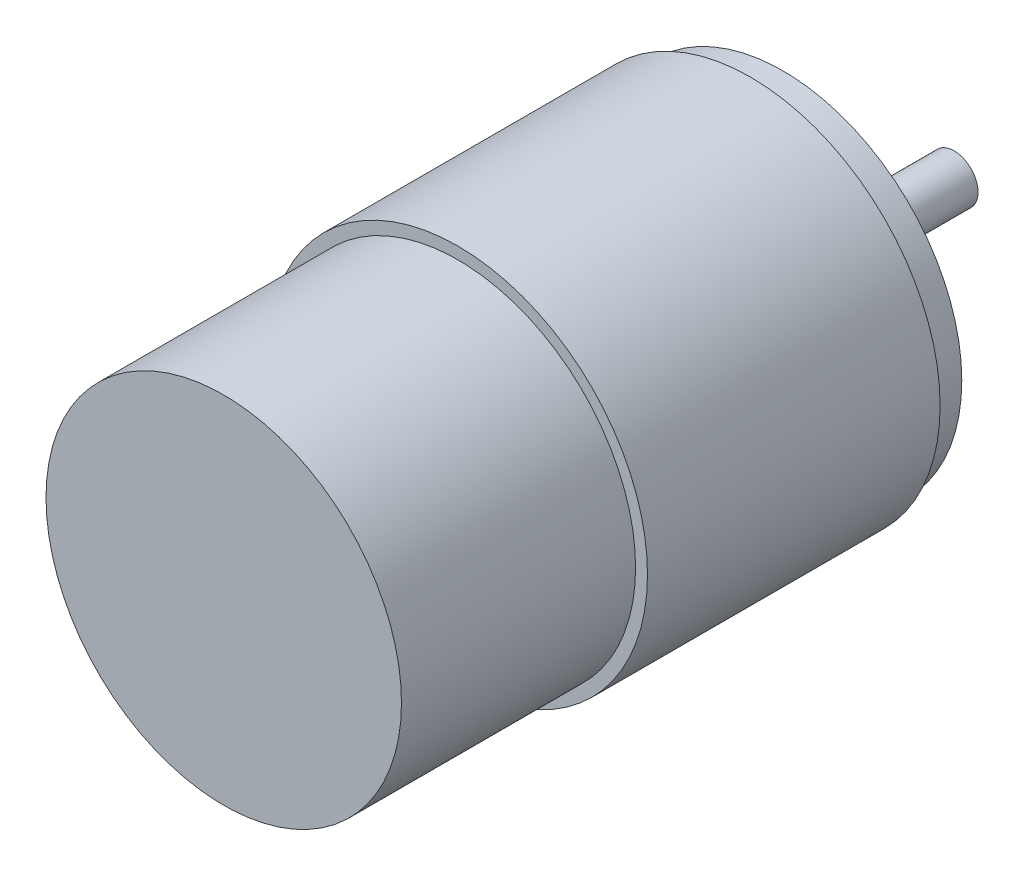
ISO-10303-21;
HEADER;
FILE_DESCRIPTION(('STEP AP214'),'2;1');
FILE_NAME('part.step','',(''),(''),'','','');
FILE_SCHEMA(('AUTOMOTIVE_DESIGN { 1 0 10303 214 1 1 1 1 }'));
ENDSEC;
DATA;
#1=APPLICATION_CONTEXT('core data for automotive mechanical design processes');
#2=APPLICATION_PROTOCOL_DEFINITION('international standard','automotive_design',2000,#1);
#3=PRODUCT_CONTEXT('',#1,'mechanical');
#4=PRODUCT('Part','Part','',(#3));
#5=PRODUCT_RELATED_PRODUCT_CATEGORY('part','',(#4));
#6=PRODUCT_DEFINITION_FORMATION('','',#4);
#7=PRODUCT_DEFINITION_CONTEXT('part definition',#1,'design');
#8=PRODUCT_DEFINITION('design','',#6,#7);
#9=PRODUCT_DEFINITION_SHAPE('','',#8);
#10=(LENGTH_UNIT() NAMED_UNIT(*) SI_UNIT(.MILLI.,.METRE.));
#11=(NAMED_UNIT(*) PLANE_ANGLE_UNIT() SI_UNIT($,.RADIAN.));
#12=(NAMED_UNIT(*) SI_UNIT($,.STERADIAN.) SOLID_ANGLE_UNIT());
#13=UNCERTAINTY_MEASURE_WITH_UNIT(LENGTH_MEASURE(1.E-05),#10,'distance_accuracy_value','');
#14=(GEOMETRIC_REPRESENTATION_CONTEXT(3) GLOBAL_UNCERTAINTY_ASSIGNED_CONTEXT((#13)) GLOBAL_UNIT_ASSIGNED_CONTEXT((#10,
#11,#12)) REPRESENTATION_CONTEXT('',''));
#15=CARTESIAN_POINT('',(0.,0.,0.));
#16=DIRECTION('',(0.,0.,1.));
#17=DIRECTION('',(1.,0.,0.));
#18=AXIS2_PLACEMENT_3D('',#15,#16,#17);
#19=CARTESIAN_POINT('',(0.,0.,3.81));
#20=DIRECTION('',(0.,0.,-1.));
#21=DIRECTION('',(-1.,0.,0.));
#22=AXIS2_PLACEMENT_3D('',#19,#20,#21);
#23=CYLINDRICAL_SURFACE('',#22,20.955);
#24=CARTESIAN_POINT('',(0.,0.,3.81));
#25=DIRECTION('',(0.,0.,1.));
#26=DIRECTION('',(1.,0.,0.));
#27=AXIS2_PLACEMENT_3D('',#24,#25,#26);
#28=CIRCLE('',#27,20.955);
#29=CARTESIAN_POINT('',(-20.955,0.,3.81));
#30=VERTEX_POINT('',#29);
#31=EDGE_CURVE('E57',#30,#30,#28,.T.);
#32=CARTESIAN_POINT('',(0.,0.,0.));
#33=DIRECTION('',(0.,0.,1.));
#34=DIRECTION('',(1.,0.,0.));
#35=AXIS2_PLACEMENT_3D('',#32,#33,#34);
#36=CIRCLE('',#35,20.955);
#37=CARTESIAN_POINT('',(-20.955,0.,0.));
#38=VERTEX_POINT('',#37);
#39=EDGE_CURVE('E34',#38,#38,#36,.T.);
#40=CARTESIAN_POINT('',(-20.955,0.,3.81));
#41=CARTESIAN_POINT('',(-20.955,0.,3.7703125));
#42=CARTESIAN_POINT('',(-20.955,0.,3.730625));
#43=CARTESIAN_POINT('',(-20.955,0.,3.65125));
#44=CARTESIAN_POINT('',(-20.955,0.,3.6115625));
#45=CARTESIAN_POINT('',(-20.955,0.,3.5321875));
#46=CARTESIAN_POINT('',(-20.955,0.,3.4925));
#47=CARTESIAN_POINT('',(-20.955,0.,3.413125));
#48=CARTESIAN_POINT('',(-20.955,0.,3.3734375));
#49=CARTESIAN_POINT('',(-20.955,0.,3.2940625));
#50=CARTESIAN_POINT('',(-20.955,0.,3.254375));
#51=CARTESIAN_POINT('',(-20.955,0.,3.175));
#52=CARTESIAN_POINT('',(-20.955,0.,3.1353125));
#53=CARTESIAN_POINT('',(-20.955,0.,3.0559375));
#54=CARTESIAN_POINT('',(-20.955,0.,3.01625));
#55=CARTESIAN_POINT('',(-20.955,0.,2.936875));
#56=CARTESIAN_POINT('',(-20.955,0.,2.8971875));
#57=CARTESIAN_POINT('',(-20.955,0.,2.8178125));
#58=CARTESIAN_POINT('',(-20.955,0.,2.778125));
#59=CARTESIAN_POINT('',(-20.955,0.,2.69875));
#60=CARTESIAN_POINT('',(-20.955,0.,2.6590625));
#61=CARTESIAN_POINT('',(-20.955,0.,2.5796875));
#62=CARTESIAN_POINT('',(-20.955,0.,2.54));
#63=CARTESIAN_POINT('',(-20.955,0.,2.460625));
#64=CARTESIAN_POINT('',(-20.955,0.,2.4209375));
#65=CARTESIAN_POINT('',(-20.955,0.,2.3415625));
#66=CARTESIAN_POINT('',(-20.955,0.,2.301875));
#67=CARTESIAN_POINT('',(-20.955,0.,2.2225));
#68=CARTESIAN_POINT('',(-20.955,0.,2.1828125));
#69=CARTESIAN_POINT('',(-20.955,0.,2.1034375));
#70=CARTESIAN_POINT('',(-20.955,0.,2.06375));
#71=CARTESIAN_POINT('',(-20.955,0.,1.984375));
#72=CARTESIAN_POINT('',(-20.955,0.,1.9446875));
#73=CARTESIAN_POINT('',(-20.955,0.,1.8653125));
#74=CARTESIAN_POINT('',(-20.955,0.,1.825625));
#75=CARTESIAN_POINT('',(-20.955,0.,1.74625));
#76=CARTESIAN_POINT('',(-20.955,0.,1.7065625));
#77=CARTESIAN_POINT('',(-20.955,0.,1.6271875));
#78=CARTESIAN_POINT('',(-20.955,0.,1.5875));
#79=CARTESIAN_POINT('',(-20.955,0.,1.508125));
#80=CARTESIAN_POINT('',(-20.955,0.,1.4684375));
#81=CARTESIAN_POINT('',(-20.955,0.,1.3890625));
#82=CARTESIAN_POINT('',(-20.955,0.,1.349375));
#83=CARTESIAN_POINT('',(-20.955,0.,1.27));
#84=CARTESIAN_POINT('',(-20.955,0.,1.2303125));
#85=CARTESIAN_POINT('',(-20.955,0.,1.1509375));
#86=CARTESIAN_POINT('',(-20.955,0.,1.11125));
#87=CARTESIAN_POINT('',(-20.955,0.,1.031875));
#88=CARTESIAN_POINT('',(-20.955,0.,0.9921875));
#89=CARTESIAN_POINT('',(-20.955,0.,0.9128125));
#90=CARTESIAN_POINT('',(-20.955,0.,0.873125));
#91=CARTESIAN_POINT('',(-20.955,0.,0.79375));
#92=CARTESIAN_POINT('',(-20.955,0.,0.7540625));
#93=CARTESIAN_POINT('',(-20.955,0.,0.6746875));
#94=CARTESIAN_POINT('',(-20.955,0.,0.635));
#95=CARTESIAN_POINT('',(-20.955,0.,0.555625));
#96=CARTESIAN_POINT('',(-20.955,0.,0.5159375));
#97=CARTESIAN_POINT('',(-20.955,0.,0.4365625));
#98=CARTESIAN_POINT('',(-20.955,0.,0.396875));
#99=CARTESIAN_POINT('',(-20.955,0.,0.3175));
#100=CARTESIAN_POINT('',(-20.955,0.,0.2778125));
#101=CARTESIAN_POINT('',(-20.955,0.,0.1984375));
#102=CARTESIAN_POINT('',(-20.955,0.,0.15875));
#103=CARTESIAN_POINT('',(-20.955,0.,0.0793749999999999));
#104=CARTESIAN_POINT('',(-20.955,0.,0.0396874999999999));
#105=CARTESIAN_POINT('',(-20.955,0.,0.));
#106=B_SPLINE_CURVE_WITH_KNOTS('',3,(#40,#41,#42,#43,#44,#45,#46,#47,#48,#49,#50,#51,#52,#53,
#54,#55,#56,#57,#58,#59,#60,#61,#62,#63,#64,#65,#66,#67,#68,#69,#70,#71,#72,#73,#74,#75,#76,#77,
#78,#79,#80,#81,#82,#83,#84,#85,#86,#87,#88,#89,#90,#91,#92,#93,#94,#95,#96,#97,#98,#99,#100,
#101,#102,#103,#104,#105),.UNSPECIFIED.,.F.,.F.,(4,2,2,2,2,2,2,2,2,2,2,2,2,2,2,2,2,2,2,2,2,2,2,
2,2,2,2,2,2,2,2,2,4),(0.,0.1190625,0.238125,0.3571875,0.47625,0.595312499999999,0.714375,
0.833437499999999,0.952499999999999,1.0715625,1.190625,1.3096875,1.42875,1.5478125,1.666875,
1.7859375,1.905,2.0240625,2.143125,2.2621875,2.38125,2.5003125,2.619375,2.7384375,2.8575,
2.9765625,3.095625,3.2146875,3.33375,3.4528125,3.571875,3.6909375,3.81),.UNSPECIFIED.);
#107=EDGE_CURVE('BSEAM31',#30,#38,#106,.T.);
#108=ORIENTED_EDGE('',*,*,#31,.F.);
#109=ORIENTED_EDGE('',*,*,#39,.T.);
#110=ORIENTED_EDGE('',*,*,#107,.T.);
#111=ORIENTED_EDGE('',*,*,#107,.F.);
#112=EDGE_LOOP('',(#108,#110,#109,#111));
#113=FACE_BOUND('',#112,.T.);
#114=ADVANCED_FACE('F31',(#113),#23,.T.);
#115=CARTESIAN_POINT('',(0.,0.,0.));
#116=DIRECTION('',(0.,0.,1.));
#117=DIRECTION('',(1.,0.,0.));
#118=AXIS2_PLACEMENT_3D('',#115,#116,#117);
#119=PLANE('',#118);
#120=CARTESIAN_POINT('',(0.,0.,0.));
#121=DIRECTION('',(0.,0.,-1.));
#122=DIRECTION('',(-1.,0.,0.));
#123=AXIS2_PLACEMENT_3D('',#120,#121,#122);
#124=CIRCLE('',#123,8.636);
#125=CARTESIAN_POINT('',(-8.636,0.,0.));
#126=VERTEX_POINT('',#125);
#127=EDGE_CURVE('E38',#126,#126,#124,.T.);
#128=ORIENTED_EDGE('',*,*,#127,.F.);
#129=EDGE_LOOP('',(#128));
#130=FACE_BOUND('',#129,.T.);
#131=ORIENTED_EDGE('',*,*,#39,.F.);
#132=EDGE_LOOP('',(#131));
#133=FACE_BOUND('',#132,.T.);
#134=ADVANCED_FACE('F69',(#130,#133),#119,.F.);
#135=CARTESIAN_POINT('',(0.,0.,38.1));
#136=DIRECTION('',(0.,0.,-1.));
#137=DIRECTION('',(-1.,0.,0.));
#138=AXIS2_PLACEMENT_3D('',#135,#136,#137);
#139=CYLINDRICAL_SURFACE('',#138,22.225);
#140=CARTESIAN_POINT('',(0.,0.,38.1));
#141=DIRECTION('',(0.,0.,1.));
#142=DIRECTION('',(1.,0.,0.));
#143=AXIS2_PLACEMENT_3D('',#140,#141,#142);
#144=CIRCLE('',#143,22.225);
#145=CARTESIAN_POINT('',(22.225,0.,38.1));
#146=VERTEX_POINT('',#145);
#147=EDGE_CURVE('E58',#146,#146,#144,.T.);
#148=ORIENTED_EDGE('',*,*,#147,.F.);
#149=EDGE_LOOP('',(#148));
#150=FACE_BOUND('',#149,.T.);
#151=CARTESIAN_POINT('',(0.,0.,3.81));
#152=DIRECTION('',(0.,0.,1.));
#153=DIRECTION('',(1.,0.,0.));
#154=AXIS2_PLACEMENT_3D('',#151,#152,#153);
#155=CIRCLE('',#154,22.225);
#156=CARTESIAN_POINT('',(22.225,0.,3.81));
#157=VERTEX_POINT('',#156);
#158=EDGE_CURVE('E54',#157,#157,#155,.T.);
#159=ORIENTED_EDGE('',*,*,#158,.T.);
#160=EDGE_LOOP('',(#159));
#161=FACE_BOUND('',#160,.T.);
#162=ADVANCED_FACE('F71',(#150,#161),#139,.T.);
#163=CARTESIAN_POINT('',(0.,0.,38.1));
#164=DIRECTION('',(0.,0.,1.));
#165=DIRECTION('',(1.,0.,0.));
#166=AXIS2_PLACEMENT_3D('',#163,#164,#165);
#167=PLANE('',#166);
#168=CARTESIAN_POINT('',(0.,0.,38.1));
#169=DIRECTION('',(0.,0.,1.));
#170=DIRECTION('',(1.,0.,0.));
#171=AXIS2_PLACEMENT_3D('',#168,#169,#170);
#172=CIRCLE('',#171,20.828);
#173=CARTESIAN_POINT('',(20.828,0.,38.1));
#174=VERTEX_POINT('',#173);
#175=EDGE_CURVE('E43',#174,#174,#172,.T.);
#176=ORIENTED_EDGE('',*,*,#175,.F.);
#177=EDGE_LOOP('',(#176));
#178=FACE_BOUND('',#177,.T.);
#179=ORIENTED_EDGE('',*,*,#147,.T.);
#180=EDGE_LOOP('',(#179));
#181=FACE_BOUND('',#180,.T.);
#182=ADVANCED_FACE('F77',(#178,#181),#167,.T.);
#183=CARTESIAN_POINT('',(0.,0.,3.81));
#184=DIRECTION('',(0.,0.,1.));
#185=DIRECTION('',(1.,0.,0.));
#186=AXIS2_PLACEMENT_3D('',#183,#184,#185);
#187=PLANE('',#186);
#188=ORIENTED_EDGE('',*,*,#31,.T.);
#189=EDGE_LOOP('',(#188));
#190=FACE_BOUND('',#189,.T.);
#191=ORIENTED_EDGE('',*,*,#158,.F.);
#192=EDGE_LOOP('',(#191));
#193=FACE_BOUND('',#192,.T.);
#194=ADVANCED_FACE('F83',(#190,#193),#187,.F.);
#195=CARTESIAN_POINT('',(0.,0.,65.532));
#196=DIRECTION('',(0.,0.,-1.));
#197=DIRECTION('',(-1.,0.,0.));
#198=AXIS2_PLACEMENT_3D('',#195,#196,#197);
#199=CYLINDRICAL_SURFACE('',#198,20.828);
#200=CARTESIAN_POINT('',(0.,0.,65.532));
#201=DIRECTION('',(0.,0.,1.));
#202=DIRECTION('',(1.,0.,0.));
#203=AXIS2_PLACEMENT_3D('',#200,#201,#202);
#204=CIRCLE('',#203,20.828);
#205=CARTESIAN_POINT('',(20.828,0.,65.532));
#206=VERTEX_POINT('',#205);
#207=EDGE_CURVE('E50',#206,#206,#204,.T.);
#208=ORIENTED_EDGE('',*,*,#207,.F.);
#209=EDGE_LOOP('',(#208));
#210=FACE_BOUND('',#209,.T.);
#211=ORIENTED_EDGE('',*,*,#175,.T.);
#212=EDGE_LOOP('',(#211));
#213=FACE_BOUND('',#212,.T.);
#214=ADVANCED_FACE('F86',(#210,#213),#199,.T.);
#215=CARTESIAN_POINT('',(0.,0.,65.532));
#216=DIRECTION('',(0.,0.,1.));
#217=DIRECTION('',(1.,0.,0.));
#218=AXIS2_PLACEMENT_3D('',#215,#216,#217);
#219=PLANE('',#218);
#220=ORIENTED_EDGE('',*,*,#207,.T.);
#221=EDGE_LOOP('',(#220));
#222=FACE_BOUND('',#221,.T.);
#223=ADVANCED_FACE('F92',(#222),#219,.T.);
#224=CARTESIAN_POINT('',(0.,0.,-4.064));
#225=DIRECTION('',(0.,0.,1.));
#226=DIRECTION('',(1.,0.,0.));
#227=AXIS2_PLACEMENT_3D('',#224,#225,#226);
#228=CYLINDRICAL_SURFACE('',#227,8.636);
#229=CARTESIAN_POINT('',(0.,0.,-4.064));
#230=DIRECTION('',(0.,0.,-1.));
#231=DIRECTION('',(-1.,0.,0.));
#232=AXIS2_PLACEMENT_3D('',#229,#230,#231);
#233=CIRCLE('',#232,8.636);
#234=CARTESIAN_POINT('',(-8.636,0.,-4.064));
#235=VERTEX_POINT('',#234);
#236=EDGE_CURVE('E48',#235,#235,#233,.T.);
#237=ORIENTED_EDGE('',*,*,#236,.F.);
#238=EDGE_LOOP('',(#237));
#239=FACE_BOUND('',#238,.T.);
#240=ORIENTED_EDGE('',*,*,#127,.T.);
#241=EDGE_LOOP('',(#240));
#242=FACE_BOUND('',#241,.T.);
#243=ADVANCED_FACE('F96',(#239,#242),#228,.T.);
#244=CARTESIAN_POINT('',(0.,0.,-4.064));
#245=DIRECTION('',(0.,0.,-1.));
#246=DIRECTION('',(-1.,0.,0.));
#247=AXIS2_PLACEMENT_3D('',#244,#245,#246);
#248=PLANE('',#247);
#249=CARTESIAN_POINT('',(0.,0.,-4.064));
#250=DIRECTION('',(0.,0.,-1.));
#251=DIRECTION('',(-1.,0.,0.));
#252=AXIS2_PLACEMENT_3D('',#249,#250,#251);
#253=CIRCLE('',#252,2.794);
#254=CARTESIAN_POINT('',(-2.794,0.,-4.064));
#255=VERTEX_POINT('',#254);
#256=EDGE_CURVE('E10',#255,#255,#253,.T.);
#257=ORIENTED_EDGE('',*,*,#256,.F.);
#258=EDGE_LOOP('',(#257));
#259=FACE_BOUND('',#258,.T.);
#260=ORIENTED_EDGE('',*,*,#236,.T.);
#261=EDGE_LOOP('',(#260));
#262=FACE_BOUND('',#261,.T.);
#263=ADVANCED_FACE('F100',(#259,#262),#248,.T.);
#264=CARTESIAN_POINT('',(0.,0.,-20.066));
#265=DIRECTION('',(0.,0.,1.));
#266=DIRECTION('',(1.,0.,0.));
#267=AXIS2_PLACEMENT_3D('',#264,#265,#266);
#268=CYLINDRICAL_SURFACE('',#267,2.794);
#269=CARTESIAN_POINT('',(0.,0.,-20.066));
#270=DIRECTION('',(0.,0.,-1.));
#271=DIRECTION('',(-1.,0.,0.));
#272=AXIS2_PLACEMENT_3D('',#269,#270,#271);
#273=CIRCLE('',#272,2.794);
#274=CARTESIAN_POINT('',(-2.794,0.,-20.066));
#275=VERTEX_POINT('',#274);
#276=EDGE_CURVE('E47',#275,#275,#273,.T.);
#277=ORIENTED_EDGE('',*,*,#276,.F.);
#278=EDGE_LOOP('',(#277));
#279=FACE_BOUND('',#278,.T.);
#280=ORIENTED_EDGE('',*,*,#256,.T.);
#281=EDGE_LOOP('',(#280));
#282=FACE_BOUND('',#281,.T.);
#283=ADVANCED_FACE('F104',(#279,#282),#268,.T.);
#284=CARTESIAN_POINT('',(0.,0.,-20.066));
#285=DIRECTION('',(0.,0.,-1.));
#286=DIRECTION('',(-1.,0.,0.));
#287=AXIS2_PLACEMENT_3D('',#284,#285,#286);
#288=PLANE('',#287);
#289=ORIENTED_EDGE('',*,*,#276,.T.);
#290=EDGE_LOOP('',(#289));
#291=FACE_BOUND('',#290,.T.);
#292=ADVANCED_FACE('F108',(#291),#288,.T.);
#293=CLOSED_SHELL('',(#114,#134,#162,#182,#194,#214,#223,#243,#263,#283,#292));
#294=MANIFOLD_SOLID_BREP('B2',#293);
#295=ADVANCED_BREP_SHAPE_REPRESENTATION('',(#18,#294),#14);
#296=SHAPE_DEFINITION_REPRESENTATION(#9,#295);
ENDSEC;
END-ISO-10303-21;
